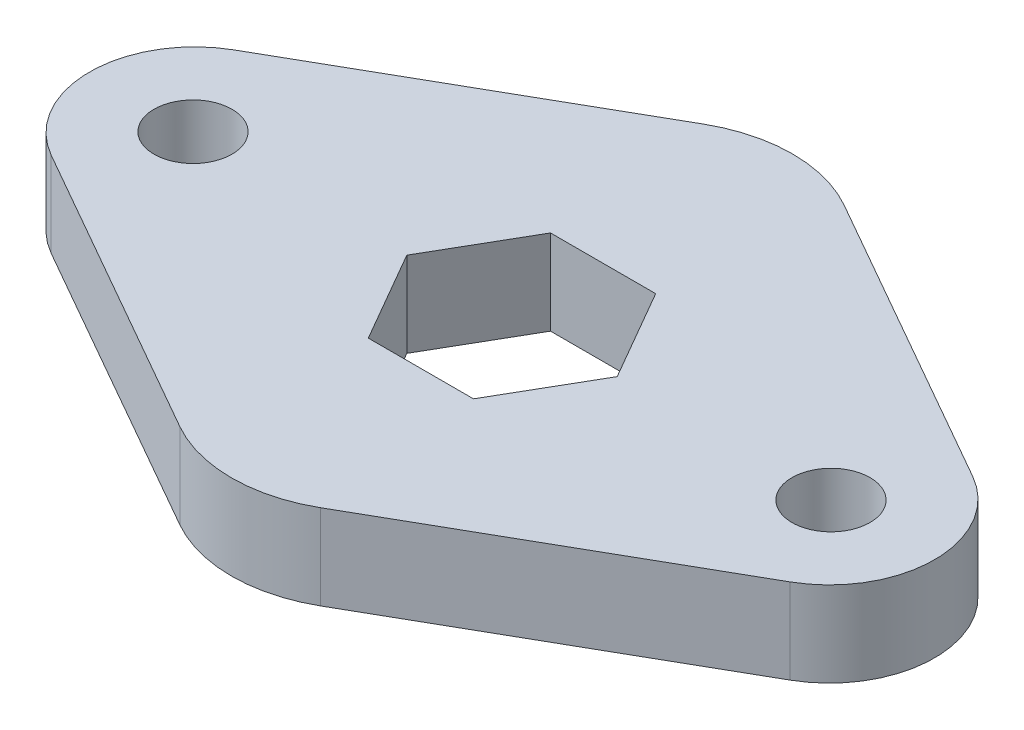
ISO-10303-21;
HEADER;
FILE_DESCRIPTION(('STEP AP214'),'2;1');
FILE_NAME('part.step','',(''),(''),'','','');
FILE_SCHEMA(('AUTOMOTIVE_DESIGN { 1 0 10303 214 1 1 1 1 }'));
ENDSEC;
DATA;
#1=APPLICATION_CONTEXT('core data for automotive mechanical design processes');
#2=APPLICATION_PROTOCOL_DEFINITION('international standard','automotive_design',2000,#1);
#3=PRODUCT_CONTEXT('',#1,'mechanical');
#4=PRODUCT('Part','Part','',(#3));
#5=PRODUCT_RELATED_PRODUCT_CATEGORY('part','',(#4));
#6=PRODUCT_DEFINITION_FORMATION('','',#4);
#7=PRODUCT_DEFINITION_CONTEXT('part definition',#1,'design');
#8=PRODUCT_DEFINITION('design','',#6,#7);
#9=PRODUCT_DEFINITION_SHAPE('','',#8);
#10=(LENGTH_UNIT() NAMED_UNIT(*) SI_UNIT(.MILLI.,.METRE.));
#11=(NAMED_UNIT(*) PLANE_ANGLE_UNIT() SI_UNIT($,.RADIAN.));
#12=(NAMED_UNIT(*) SI_UNIT($,.STERADIAN.) SOLID_ANGLE_UNIT());
#13=UNCERTAINTY_MEASURE_WITH_UNIT(LENGTH_MEASURE(1.E-05),#10,'distance_accuracy_value','');
#14=(GEOMETRIC_REPRESENTATION_CONTEXT(3) GLOBAL_UNCERTAINTY_ASSIGNED_CONTEXT((#13)) GLOBAL_UNIT_ASSIGNED_CONTEXT((#10,
#11,#12)) REPRESENTATION_CONTEXT('',''));
#15=CARTESIAN_POINT('',(0.,0.,0.));
#16=DIRECTION('',(0.,0.,1.));
#17=DIRECTION('',(1.,0.,0.));
#18=AXIS2_PLACEMENT_3D('',#15,#16,#17);
#19=CARTESIAN_POINT('',(190.,-173.122439360108,-14.3881775510622));
#20=DIRECTION('',(0.,-1.,0.));
#21=DIRECTION('',(0.,0.,-1.));
#22=AXIS2_PLACEMENT_3D('',#19,#20,#21);
#23=PLANE('',#22);
#24=CARTESIAN_POINT('',(167.5,-173.122439360108,-4.60000000000002));
#25=DIRECTION('',(0.,-1.,0.));
#26=DIRECTION('',(0.,0.,-1.));
#27=AXIS2_PLACEMENT_3D('',#24,#25,#26);
#28=CIRCLE('',#27,2.75000000000001);
#29=CARTESIAN_POINT('',(167.5,-173.122439360108,-7.35000000000003));
#30=VERTEX_POINT('',#29);
#31=EDGE_CURVE('E187',#30,#30,#28,.T.);
#32=ORIENTED_EDGE('',*,*,#31,.F.);
#33=EDGE_LOOP('',(#32));
#34=FACE_BOUND('',#33,.T.);
#35=CARTESIAN_POINT('',(190.,-173.122439360108,-14.3881775510622));
#36=DIRECTION('',(0.,-1.,0.));
#37=DIRECTION('',(0.,0.,-1.));
#38=AXIS2_PLACEMENT_3D('',#35,#36,#37);
#39=CIRCLE('',#38,10.);
#40=CARTESIAN_POINT('',(185.04612647539,-173.122439360108,-23.0748994357648));
#41=VERTEX_POINT('',#40);
#42=CARTESIAN_POINT('',(194.95387352461,-173.122439360108,-23.0748994357648));
#43=VERTEX_POINT('',#42);
#44=EDGE_CURVE('E199',#41,#43,#39,.T.);
#45=ORIENTED_EDGE('',*,*,#44,.T.);
#46=DIRECTION('',(0.868672188470268,0.,0.495387352460956));
#47=VECTOR('',#46,1.);
#48=CARTESIAN_POINT('',(216.05982548892,-173.122439360108,-11.0385734159574));
#49=LINE('',#48,#47);
#50=CARTESIAN_POINT('',(216.05982548892,-173.122439360108,-11.0385734159574));
#51=VERTEX_POINT('',#50);
#52=EDGE_CURVE('E202',#43,#51,#49,.T.);
#53=ORIENTED_EDGE('',*,*,#52,.T.);
#54=CARTESIAN_POINT('',(212.388028601105,-173.122439360108,-4.60000000000003));
#55=DIRECTION('',(0.,-1.,0.));
#56=DIRECTION('',(0.,0.,-1.));
#57=AXIS2_PLACEMENT_3D('',#54,#55,#56);
#58=CIRCLE('',#57,7.41197139889526);
#59=CARTESIAN_POINT('',(216.05982548892,-173.122439360108,1.83857341595736));
#60=VERTEX_POINT('',#59);
#61=EDGE_CURVE('E205',#51,#60,#58,.T.);
#62=ORIENTED_EDGE('',*,*,#61,.T.);
#63=DIRECTION('',(-0.868672188470268,0.,0.495387352460956));
#64=VECTOR('',#63,1.);
#65=CARTESIAN_POINT('',(216.05982548892,-173.122439360108,1.83857341595736));
#66=LINE('',#65,#64);
#67=CARTESIAN_POINT('',(194.95387352461,-173.122439360108,13.8748994357648));
#68=VERTEX_POINT('',#67);
#69=EDGE_CURVE('E207',#60,#68,#66,.T.);
#70=ORIENTED_EDGE('',*,*,#69,.T.);
#71=CARTESIAN_POINT('',(190.,-173.122439360108,5.18817755106213));
#72=DIRECTION('',(0.,-1.,0.));
#73=DIRECTION('',(0.,0.,-1.));
#74=AXIS2_PLACEMENT_3D('',#71,#72,#73);
#75=CIRCLE('',#74,10.);
#76=CARTESIAN_POINT('',(185.04612647539,-173.122439360108,13.8748994357648));
#77=VERTEX_POINT('',#76);
#78=EDGE_CURVE('E209',#68,#77,#75,.T.);
#79=ORIENTED_EDGE('',*,*,#78,.T.);
#80=DIRECTION('',(-0.868672188470268,0.,-0.495387352460956));
#81=VECTOR('',#80,1.);
#82=CARTESIAN_POINT('',(163.94017451108,-173.122439360108,1.83857341595736));
#83=LINE('',#82,#81);
#84=CARTESIAN_POINT('',(163.94017451108,-173.122439360108,1.83857341595736));
#85=VERTEX_POINT('',#84);
#86=EDGE_CURVE('E211',#77,#85,#83,.T.);
#87=ORIENTED_EDGE('',*,*,#86,.T.);
#88=CARTESIAN_POINT('',(167.611971398895,-173.122439360108,-4.60000000000003));
#89=DIRECTION('',(0.,-1.,0.));
#90=DIRECTION('',(0.,0.,-1.));
#91=AXIS2_PLACEMENT_3D('',#88,#89,#90);
#92=CIRCLE('',#91,7.41197139889526);
#93=CARTESIAN_POINT('',(163.94017451108,-173.122439360108,-11.0385734159574));
#94=VERTEX_POINT('',#93);
#95=EDGE_CURVE('E213',#85,#94,#92,.T.);
#96=ORIENTED_EDGE('',*,*,#95,.T.);
#97=DIRECTION('',(0.868672188470268,0.,-0.495387352460956));
#98=VECTOR('',#97,1.);
#99=CARTESIAN_POINT('',(163.94017451108,-173.122439360108,-11.0385734159574));
#100=LINE('',#99,#98);
#101=EDGE_CURVE('E215',#94,#41,#100,.T.);
#102=ORIENTED_EDGE('',*,*,#101,.T.);
#103=EDGE_LOOP('',(#45,#53,#62,#70,#79,#87,#96,#102));
#104=FACE_BOUND('',#103,.T.);
#105=CARTESIAN_POINT('',(212.5,-173.122439360108,-4.60000000000002));
#106=DIRECTION('',(0.,-1.,0.));
#107=DIRECTION('',(0.,0.,-1.));
#108=AXIS2_PLACEMENT_3D('',#105,#106,#107);
#109=CIRCLE('',#108,2.75000000000001);
#110=CARTESIAN_POINT('',(212.5,-173.122439360108,-7.35000000000003));
#111=VERTEX_POINT('',#110);
#112=EDGE_CURVE('E193',#111,#111,#109,.T.);
#113=ORIENTED_EDGE('',*,*,#112,.F.);
#114=EDGE_LOOP('',(#113));
#115=FACE_BOUND('',#114,.T.);
#116=DIRECTION('',(1.,0.,0.));
#117=VECTOR('',#116,1.);
#118=CARTESIAN_POINT('',(186.290524520457,-173.122439360108,-11.025));
#119=LINE('',#118,#117);
#120=CARTESIAN_POINT('',(186.290524520457,-173.122439360108,-11.025));
#121=VERTEX_POINT('',#120);
#122=CARTESIAN_POINT('',(193.709475479543,-173.122439360108,-11.025));
#123=VERTEX_POINT('',#122);
#124=EDGE_CURVE('E144',#121,#123,#119,.T.);
#125=ORIENTED_EDGE('',*,*,#124,.F.);
#126=DIRECTION('',(0.500000000000002,0.,-0.866025403784437));
#127=VECTOR('',#126,1.);
#128=CARTESIAN_POINT('',(182.581049040913,-173.122439360108,-4.60000000000002));
#129=LINE('',#128,#127);
#130=CARTESIAN_POINT('',(182.581049040913,-173.122439360108,-4.60000000000002));
#131=VERTEX_POINT('',#130);
#132=EDGE_CURVE('E136',#131,#121,#129,.T.);
#133=ORIENTED_EDGE('',*,*,#132,.F.);
#134=DIRECTION('',(-0.500000000000002,0.,-0.866025403784437));
#135=VECTOR('',#134,1.);
#136=CARTESIAN_POINT('',(186.290524520457,-173.122439360108,1.82499999999998));
#137=LINE('',#136,#135);
#138=CARTESIAN_POINT('',(186.290524520457,-173.122439360108,1.82499999999998));
#139=VERTEX_POINT('',#138);
#140=EDGE_CURVE('E165',#139,#131,#137,.T.);
#141=ORIENTED_EDGE('',*,*,#140,.F.);
#142=DIRECTION('',(-1.,0.,0.));
#143=VECTOR('',#142,1.);
#144=CARTESIAN_POINT('',(193.709475479543,-173.122439360108,1.82499999999998));
#145=LINE('',#144,#143);
#146=CARTESIAN_POINT('',(193.709475479543,-173.122439360108,1.82499999999998));
#147=VERTEX_POINT('',#146);
#148=EDGE_CURVE('E163',#147,#139,#145,.T.);
#149=ORIENTED_EDGE('',*,*,#148,.F.);
#150=DIRECTION('',(-0.5,0.,0.866025403784438));
#151=VECTOR('',#150,1.);
#152=CARTESIAN_POINT('',(197.418950959087,-173.122439360108,-4.60000000000001));
#153=LINE('',#152,#151);
#154=CARTESIAN_POINT('',(197.418950959087,-173.122439360108,-4.60000000000001));
#155=VERTEX_POINT('',#154);
#156=EDGE_CURVE('E159',#155,#147,#153,.T.);
#157=ORIENTED_EDGE('',*,*,#156,.F.);
#158=DIRECTION('',(0.500000000000001,0.,0.866025403784438));
#159=VECTOR('',#158,1.);
#160=CARTESIAN_POINT('',(193.709475479543,-173.122439360108,-11.025));
#161=LINE('',#160,#159);
#162=EDGE_CURVE('E157',#123,#155,#161,.T.);
#163=ORIENTED_EDGE('',*,*,#162,.F.);
#164=EDGE_LOOP('',(#125,#133,#141,#149,#157,#163));
#165=FACE_BOUND('',#164,.T.);
#166=ADVANCED_FACE('F35',(#34,#104,#115,#165),#23,.T.);
#167=CARTESIAN_POINT('',(190.,-167.122439360108,-14.3881775510622));
#168=DIRECTION('',(0.,-1.,0.));
#169=DIRECTION('',(0.,0.,-1.));
#170=AXIS2_PLACEMENT_3D('',#167,#168,#169);
#171=PLANE('',#170);
#172=CARTESIAN_POINT('',(167.5,-167.122439360108,-4.60000000000002));
#173=DIRECTION('',(0.,-1.,0.));
#174=DIRECTION('',(0.,0.,-1.));
#175=AXIS2_PLACEMENT_3D('',#172,#173,#174);
#176=CIRCLE('',#175,2.75000000000001);
#177=CARTESIAN_POINT('',(167.5,-167.122439360108,-7.35000000000003));
#178=VERTEX_POINT('',#177);
#179=EDGE_CURVE('E152',#178,#178,#176,.T.);
#180=ORIENTED_EDGE('',*,*,#179,.T.);
#181=EDGE_LOOP('',(#180));
#182=FACE_BOUND('',#181,.T.);
#183=CARTESIAN_POINT('',(190.,-167.122439360108,-14.3881775510622));
#184=DIRECTION('',(0.,-1.,0.));
#185=DIRECTION('',(0.,0.,-1.));
#186=AXIS2_PLACEMENT_3D('',#183,#184,#185);
#187=CIRCLE('',#186,10.);
#188=CARTESIAN_POINT('',(185.04612647539,-167.122439360108,-23.0748994357648));
#189=VERTEX_POINT('',#188);
#190=CARTESIAN_POINT('',(194.95387352461,-167.122439360108,-23.0748994357648));
#191=VERTEX_POINT('',#190);
#192=EDGE_CURVE('E196',#189,#191,#187,.T.);
#193=ORIENTED_EDGE('',*,*,#192,.F.);
#194=DIRECTION('',(0.868672188470268,0.,-0.495387352460956));
#195=VECTOR('',#194,1.);
#196=CARTESIAN_POINT('',(163.94017451108,-167.122439360108,-11.0385734159574));
#197=LINE('',#196,#195);
#198=CARTESIAN_POINT('',(163.94017451108,-167.122439360108,-11.0385734159574));
#199=VERTEX_POINT('',#198);
#200=EDGE_CURVE('E203',#199,#189,#197,.T.);
#201=ORIENTED_EDGE('',*,*,#200,.F.);
#202=CARTESIAN_POINT('',(167.611971398895,-167.122439360108,-4.60000000000003));
#203=DIRECTION('',(0.,-1.,0.));
#204=DIRECTION('',(0.,0.,-1.));
#205=AXIS2_PLACEMENT_3D('',#202,#203,#204);
#206=CIRCLE('',#205,7.41197139889526);
#207=CARTESIAN_POINT('',(163.94017451108,-167.122439360108,1.83857341595736));
#208=VERTEX_POINT('',#207);
#209=EDGE_CURVE('E230',#208,#199,#206,.T.);
#210=ORIENTED_EDGE('',*,*,#209,.F.);
#211=DIRECTION('',(-0.868672188470268,0.,-0.495387352460956));
#212=VECTOR('',#211,1.);
#213=CARTESIAN_POINT('',(163.94017451108,-167.122439360108,1.83857341595736));
#214=LINE('',#213,#212);
#215=CARTESIAN_POINT('',(185.04612647539,-167.122439360108,13.8748994357648));
#216=VERTEX_POINT('',#215);
#217=EDGE_CURVE('E228',#216,#208,#214,.T.);
#218=ORIENTED_EDGE('',*,*,#217,.F.);
#219=CARTESIAN_POINT('',(190.,-167.122439360108,5.18817755106213));
#220=DIRECTION('',(0.,-1.,0.));
#221=DIRECTION('',(0.,0.,-1.));
#222=AXIS2_PLACEMENT_3D('',#219,#220,#221);
#223=CIRCLE('',#222,10.);
#224=CARTESIAN_POINT('',(194.95387352461,-167.122439360108,13.8748994357648));
#225=VERTEX_POINT('',#224);
#226=EDGE_CURVE('E226',#225,#216,#223,.T.);
#227=ORIENTED_EDGE('',*,*,#226,.F.);
#228=DIRECTION('',(-0.868672188470268,0.,0.495387352460956));
#229=VECTOR('',#228,1.);
#230=CARTESIAN_POINT('',(216.05982548892,-167.122439360108,1.83857341595736));
#231=LINE('',#230,#229);
#232=CARTESIAN_POINT('',(216.05982548892,-167.122439360108,1.83857341595736));
#233=VERTEX_POINT('',#232);
#234=EDGE_CURVE('E224',#233,#225,#231,.T.);
#235=ORIENTED_EDGE('',*,*,#234,.F.);
#236=CARTESIAN_POINT('',(212.388028601105,-167.122439360108,-4.60000000000003));
#237=DIRECTION('',(0.,-1.,0.));
#238=DIRECTION('',(0.,0.,-1.));
#239=AXIS2_PLACEMENT_3D('',#236,#237,#238);
#240=CIRCLE('',#239,7.41197139889526);
#241=CARTESIAN_POINT('',(216.05982548892,-167.122439360108,-11.0385734159574));
#242=VERTEX_POINT('',#241);
#243=EDGE_CURVE('E222',#242,#233,#240,.T.);
#244=ORIENTED_EDGE('',*,*,#243,.F.);
#245=DIRECTION('',(0.868672188470268,0.,0.495387352460956));
#246=VECTOR('',#245,1.);
#247=CARTESIAN_POINT('',(216.05982548892,-167.122439360108,-11.0385734159574));
#248=LINE('',#247,#246);
#249=EDGE_CURVE('E220',#191,#242,#248,.T.);
#250=ORIENTED_EDGE('',*,*,#249,.F.);
#251=EDGE_LOOP('',(#193,#201,#210,#218,#227,#235,#244,#250));
#252=FACE_BOUND('',#251,.T.);
#253=CARTESIAN_POINT('',(212.5,-167.122439360108,-4.60000000000002));
#254=DIRECTION('',(0.,-1.,0.));
#255=DIRECTION('',(0.,0.,-1.));
#256=AXIS2_PLACEMENT_3D('',#253,#254,#255);
#257=CIRCLE('',#256,2.75000000000001);
#258=CARTESIAN_POINT('',(212.5,-167.122439360108,-7.35000000000003));
#259=VERTEX_POINT('',#258);
#260=EDGE_CURVE('E190',#259,#259,#257,.T.);
#261=ORIENTED_EDGE('',*,*,#260,.T.);
#262=EDGE_LOOP('',(#261));
#263=FACE_BOUND('',#262,.T.);
#264=DIRECTION('',(0.500000000000002,0.,-0.866025403784437));
#265=VECTOR('',#264,1.);
#266=CARTESIAN_POINT('',(182.581049040913,-167.122439360108,-4.60000000000002));
#267=LINE('',#266,#265);
#268=CARTESIAN_POINT('',(182.581049040913,-167.122439360108,-4.60000000000002));
#269=VERTEX_POINT('',#268);
#270=CARTESIAN_POINT('',(186.290524520457,-167.122439360108,-11.025));
#271=VERTEX_POINT('',#270);
#272=EDGE_CURVE('E58',#269,#271,#267,.T.);
#273=ORIENTED_EDGE('',*,*,#272,.T.);
#274=DIRECTION('',(1.,0.,0.));
#275=VECTOR('',#274,1.);
#276=CARTESIAN_POINT('',(186.290524520457,-167.122439360108,-11.025));
#277=LINE('',#276,#275);
#278=CARTESIAN_POINT('',(193.709475479543,-167.122439360108,-11.025));
#279=VERTEX_POINT('',#278);
#280=EDGE_CURVE('E151',#271,#279,#277,.T.);
#281=ORIENTED_EDGE('',*,*,#280,.T.);
#282=DIRECTION('',(0.500000000000001,0.,0.866025403784438));
#283=VECTOR('',#282,1.);
#284=CARTESIAN_POINT('',(193.709475479543,-167.122439360108,-11.025));
#285=LINE('',#284,#283);
#286=CARTESIAN_POINT('',(197.418950959087,-167.122439360108,-4.60000000000001));
#287=VERTEX_POINT('',#286);
#288=EDGE_CURVE('E169',#279,#287,#285,.T.);
#289=ORIENTED_EDGE('',*,*,#288,.T.);
#290=DIRECTION('',(-0.5,0.,0.866025403784438));
#291=VECTOR('',#290,1.);
#292=CARTESIAN_POINT('',(197.418950959087,-167.122439360108,-4.60000000000001));
#293=LINE('',#292,#291);
#294=CARTESIAN_POINT('',(193.709475479543,-167.122439360108,1.82499999999998));
#295=VERTEX_POINT('',#294);
#296=EDGE_CURVE('E172',#287,#295,#293,.T.);
#297=ORIENTED_EDGE('',*,*,#296,.T.);
#298=DIRECTION('',(-1.,0.,0.));
#299=VECTOR('',#298,1.);
#300=CARTESIAN_POINT('',(193.709475479543,-167.122439360108,1.82499999999998));
#301=LINE('',#300,#299);
#302=CARTESIAN_POINT('',(186.290524520457,-167.122439360108,1.82499999999998));
#303=VERTEX_POINT('',#302);
#304=EDGE_CURVE('E175',#295,#303,#301,.T.);
#305=ORIENTED_EDGE('',*,*,#304,.T.);
#306=DIRECTION('',(-0.500000000000002,0.,-0.866025403784437));
#307=VECTOR('',#306,1.);
#308=CARTESIAN_POINT('',(186.290524520457,-167.122439360108,1.82499999999998));
#309=LINE('',#308,#307);
#310=EDGE_CURVE('E145',#303,#269,#309,.T.);
#311=ORIENTED_EDGE('',*,*,#310,.T.);
#312=EDGE_LOOP('',(#273,#281,#289,#297,#305,#311));
#313=FACE_BOUND('',#312,.T.);
#314=ADVANCED_FACE('F260',(#182,#252,#263,#313),#171,.F.);
#315=CARTESIAN_POINT('',(190.,-173.122439360108,-14.3881775510622));
#316=DIRECTION('',(0.,1.,0.));
#317=DIRECTION('',(0.,0.,1.));
#318=AXIS2_PLACEMENT_3D('',#315,#316,#317);
#319=CYLINDRICAL_SURFACE('',#318,10.);
#320=ORIENTED_EDGE('',*,*,#192,.T.);
#321=DIRECTION('',(0.,1.,0.));
#322=VECTOR('',#321,1.);
#323=CARTESIAN_POINT('',(194.95387352461,-173.122439360108,-23.0748994357648));
#324=LINE('',#323,#322);
#325=EDGE_CURVE('E11',#43,#191,#324,.T.);
#326=ORIENTED_EDGE('',*,*,#325,.F.);
#327=ORIENTED_EDGE('',*,*,#44,.F.);
#328=DIRECTION('',(0.,1.,0.));
#329=VECTOR('',#328,1.);
#330=CARTESIAN_POINT('',(185.04612647539,-173.122439360108,-23.0748994357648));
#331=LINE('',#330,#329);
#332=EDGE_CURVE('E217',#41,#189,#331,.T.);
#333=ORIENTED_EDGE('',*,*,#332,.T.);
#334=EDGE_LOOP('',(#320,#326,#327,#333));
#335=FACE_BOUND('',#334,.T.);
#336=ADVANCED_FACE('F37',(#335),#319,.T.);
#337=CARTESIAN_POINT('',(216.05982548892,-173.122439360108,-11.0385734159574));
#338=DIRECTION('',(-0.495387352460956,0.,0.868672188470268));
#339=DIRECTION('',(0.868672188470268,0.,0.495387352460956));
#340=AXIS2_PLACEMENT_3D('',#337,#338,#339);
#341=PLANE('',#340);
#342=ORIENTED_EDGE('',*,*,#249,.T.);
#343=DIRECTION('',(0.,1.,0.));
#344=VECTOR('',#343,1.);
#345=CARTESIAN_POINT('',(216.05982548892,-173.122439360108,-11.0385734159574));
#346=LINE('',#345,#344);
#347=EDGE_CURVE('E43',#51,#242,#346,.T.);
#348=ORIENTED_EDGE('',*,*,#347,.F.);
#349=ORIENTED_EDGE('',*,*,#52,.F.);
#350=ORIENTED_EDGE('',*,*,#325,.T.);
#351=EDGE_LOOP('',(#342,#348,#349,#350));
#352=FACE_BOUND('',#351,.T.);
#353=ADVANCED_FACE('F278',(#352),#341,.F.);
#354=CARTESIAN_POINT('',(212.388028601105,-173.122439360108,-4.60000000000003));
#355=DIRECTION('',(0.,1.,0.));
#356=DIRECTION('',(0.,0.,1.));
#357=AXIS2_PLACEMENT_3D('',#354,#355,#356);
#358=CYLINDRICAL_SURFACE('',#357,7.41197139889526);
#359=ORIENTED_EDGE('',*,*,#243,.T.);
#360=DIRECTION('',(0.,1.,0.));
#361=VECTOR('',#360,1.);
#362=CARTESIAN_POINT('',(216.05982548892,-173.122439360108,1.83857341595736));
#363=LINE('',#362,#361);
#364=EDGE_CURVE('E247',#60,#233,#363,.T.);
#365=ORIENTED_EDGE('',*,*,#364,.F.);
#366=ORIENTED_EDGE('',*,*,#61,.F.);
#367=ORIENTED_EDGE('',*,*,#347,.T.);
#368=EDGE_LOOP('',(#359,#365,#366,#367));
#369=FACE_BOUND('',#368,.T.);
#370=ADVANCED_FACE('F254',(#369),#358,.T.);
#371=CARTESIAN_POINT('',(216.05982548892,-173.122439360108,1.83857341595736));
#372=DIRECTION('',(-0.495387352460957,0.,-0.868672188470268));
#373=DIRECTION('',(-0.868672188470268,0.,0.495387352460957));
#374=AXIS2_PLACEMENT_3D('',#371,#372,#373);
#375=PLANE('',#374);
#376=ORIENTED_EDGE('',*,*,#234,.T.);
#377=DIRECTION('',(0.,1.,0.));
#378=VECTOR('',#377,1.);
#379=CARTESIAN_POINT('',(194.95387352461,-173.122439360108,13.8748994357648));
#380=LINE('',#379,#378);
#381=EDGE_CURVE('E244',#68,#225,#380,.T.);
#382=ORIENTED_EDGE('',*,*,#381,.F.);
#383=ORIENTED_EDGE('',*,*,#69,.F.);
#384=ORIENTED_EDGE('',*,*,#364,.T.);
#385=EDGE_LOOP('',(#376,#382,#383,#384));
#386=FACE_BOUND('',#385,.T.);
#387=ADVANCED_FACE('F266',(#386),#375,.F.);
#388=CARTESIAN_POINT('',(190.,-173.122439360108,5.18817755106213));
#389=DIRECTION('',(0.,1.,0.));
#390=DIRECTION('',(0.,0.,1.));
#391=AXIS2_PLACEMENT_3D('',#388,#389,#390);
#392=CYLINDRICAL_SURFACE('',#391,10.);
#393=ORIENTED_EDGE('',*,*,#226,.T.);
#394=DIRECTION('',(0.,1.,0.));
#395=VECTOR('',#394,1.);
#396=CARTESIAN_POINT('',(185.04612647539,-173.122439360108,13.8748994357648));
#397=LINE('',#396,#395);
#398=EDGE_CURVE('E241',#77,#216,#397,.T.);
#399=ORIENTED_EDGE('',*,*,#398,.F.);
#400=ORIENTED_EDGE('',*,*,#78,.F.);
#401=ORIENTED_EDGE('',*,*,#381,.T.);
#402=EDGE_LOOP('',(#393,#399,#400,#401));
#403=FACE_BOUND('',#402,.T.);
#404=ADVANCED_FACE('F270',(#403),#392,.T.);
#405=CARTESIAN_POINT('',(163.94017451108,-173.122439360108,1.83857341595736));
#406=DIRECTION('',(0.495387352460957,0.,-0.868672188470268));
#407=DIRECTION('',(-0.868672188470268,0.,-0.495387352460957));
#408=AXIS2_PLACEMENT_3D('',#405,#406,#407);
#409=PLANE('',#408);
#410=ORIENTED_EDGE('',*,*,#217,.T.);
#411=DIRECTION('',(0.,1.,0.));
#412=VECTOR('',#411,1.);
#413=CARTESIAN_POINT('',(163.94017451108,-173.122439360108,1.83857341595736));
#414=LINE('',#413,#412);
#415=EDGE_CURVE('E238',#85,#208,#414,.T.);
#416=ORIENTED_EDGE('',*,*,#415,.F.);
#417=ORIENTED_EDGE('',*,*,#86,.F.);
#418=ORIENTED_EDGE('',*,*,#398,.T.);
#419=EDGE_LOOP('',(#410,#416,#417,#418));
#420=FACE_BOUND('',#419,.T.);
#421=ADVANCED_FACE('F291',(#420),#409,.F.);
#422=CARTESIAN_POINT('',(167.611971398895,-173.122439360108,-4.60000000000003));
#423=DIRECTION('',(0.,1.,0.));
#424=DIRECTION('',(0.,0.,1.));
#425=AXIS2_PLACEMENT_3D('',#422,#423,#424);
#426=CYLINDRICAL_SURFACE('',#425,7.41197139889526);
#427=ORIENTED_EDGE('',*,*,#209,.T.);
#428=DIRECTION('',(0.,1.,0.));
#429=VECTOR('',#428,1.);
#430=CARTESIAN_POINT('',(163.94017451108,-173.122439360108,-11.0385734159574));
#431=LINE('',#430,#429);
#432=EDGE_CURVE('E235',#94,#199,#431,.T.);
#433=ORIENTED_EDGE('',*,*,#432,.F.);
#434=ORIENTED_EDGE('',*,*,#95,.F.);
#435=ORIENTED_EDGE('',*,*,#415,.T.);
#436=EDGE_LOOP('',(#427,#433,#434,#435));
#437=FACE_BOUND('',#436,.T.);
#438=ADVANCED_FACE('F289',(#437),#426,.T.);
#439=CARTESIAN_POINT('',(163.94017451108,-173.122439360108,-11.0385734159574));
#440=DIRECTION('',(0.495387352460956,0.,0.868672188470268));
#441=DIRECTION('',(0.868672188470268,0.,-0.495387352460956));
#442=AXIS2_PLACEMENT_3D('',#439,#440,#441);
#443=PLANE('',#442);
#444=ORIENTED_EDGE('',*,*,#200,.T.);
#445=ORIENTED_EDGE('',*,*,#332,.F.);
#446=ORIENTED_EDGE('',*,*,#101,.F.);
#447=ORIENTED_EDGE('',*,*,#432,.T.);
#448=EDGE_LOOP('',(#444,#445,#446,#447));
#449=FACE_BOUND('',#448,.T.);
#450=ADVANCED_FACE('F284',(#449),#443,.F.);
#451=CARTESIAN_POINT('',(212.5,-173.122439360108,-4.60000000000002));
#452=DIRECTION('',(0.,1.,0.));
#453=DIRECTION('',(0.,0.,1.));
#454=AXIS2_PLACEMENT_3D('',#451,#452,#453);
#455=CYLINDRICAL_SURFACE('',#454,2.75000000000001);
#456=ORIENTED_EDGE('',*,*,#112,.T.);
#457=EDGE_LOOP('',(#456));
#458=FACE_BOUND('',#457,.T.);
#459=ORIENTED_EDGE('',*,*,#260,.F.);
#460=EDGE_LOOP('',(#459));
#461=FACE_BOUND('',#460,.T.);
#462=ADVANCED_FACE('F310',(#458,#461),#455,.F.);
#463=CARTESIAN_POINT('',(167.5,-173.122439360108,-4.60000000000002));
#464=DIRECTION('',(0.,1.,0.));
#465=DIRECTION('',(0.,0.,1.));
#466=AXIS2_PLACEMENT_3D('',#463,#464,#465);
#467=CYLINDRICAL_SURFACE('',#466,2.75000000000001);
#468=ORIENTED_EDGE('',*,*,#31,.T.);
#469=EDGE_LOOP('',(#468));
#470=FACE_BOUND('',#469,.T.);
#471=ORIENTED_EDGE('',*,*,#179,.F.);
#472=EDGE_LOOP('',(#471));
#473=FACE_BOUND('',#472,.T.);
#474=ADVANCED_FACE('F317',(#470,#473),#467,.F.);
#475=CARTESIAN_POINT('',(182.581049040913,-173.122439360108,-4.60000000000002));
#476=DIRECTION('',(0.866025403784437,0.,0.500000000000002));
#477=DIRECTION('',(0.500000000000002,0.,-0.866025403784437));
#478=AXIS2_PLACEMENT_3D('',#475,#476,#477);
#479=PLANE('',#478);
#480=ORIENTED_EDGE('',*,*,#272,.F.);
#481=DIRECTION('',(0.,1.,0.));
#482=VECTOR('',#481,1.);
#483=CARTESIAN_POINT('',(182.581049040913,-173.122439360108,-4.60000000000002));
#484=LINE('',#483,#482);
#485=EDGE_CURVE('E140',#131,#269,#484,.T.);
#486=ORIENTED_EDGE('',*,*,#485,.F.);
#487=ORIENTED_EDGE('',*,*,#132,.T.);
#488=DIRECTION('',(0.,1.,0.));
#489=VECTOR('',#488,1.);
#490=CARTESIAN_POINT('',(186.290524520457,-173.122439360108,-11.025));
#491=LINE('',#490,#489);
#492=EDGE_CURVE('E139',#121,#271,#491,.T.);
#493=ORIENTED_EDGE('',*,*,#492,.T.);
#494=EDGE_LOOP('',(#480,#486,#487,#493));
#495=FACE_BOUND('',#494,.T.);
#496=ADVANCED_FACE('F138',(#495),#479,.T.);
#497=CARTESIAN_POINT('',(186.290524520457,-173.122439360108,-11.025));
#498=DIRECTION('',(0.,0.,1.));
#499=DIRECTION('',(1.,0.,0.));
#500=AXIS2_PLACEMENT_3D('',#497,#498,#499);
#501=PLANE('',#500);
#502=ORIENTED_EDGE('',*,*,#280,.F.);
#503=ORIENTED_EDGE('',*,*,#492,.F.);
#504=ORIENTED_EDGE('',*,*,#124,.T.);
#505=DIRECTION('',(0.,1.,0.));
#506=VECTOR('',#505,1.);
#507=CARTESIAN_POINT('',(193.709475479543,-173.122439360108,-11.025));
#508=LINE('',#507,#506);
#509=EDGE_CURVE('E153',#123,#279,#508,.T.);
#510=ORIENTED_EDGE('',*,*,#509,.T.);
#511=EDGE_LOOP('',(#502,#503,#504,#510));
#512=FACE_BOUND('',#511,.T.);
#513=ADVANCED_FACE('F148',(#512),#501,.T.);
#514=CARTESIAN_POINT('',(193.709475479543,-173.122439360108,-11.025));
#515=DIRECTION('',(-0.866025403784438,0.,0.500000000000001));
#516=DIRECTION('',(0.500000000000001,0.,0.866025403784438));
#517=AXIS2_PLACEMENT_3D('',#514,#515,#516);
#518=PLANE('',#517);
#519=ORIENTED_EDGE('',*,*,#288,.F.);
#520=ORIENTED_EDGE('',*,*,#509,.F.);
#521=ORIENTED_EDGE('',*,*,#162,.T.);
#522=DIRECTION('',(0.,1.,0.));
#523=VECTOR('',#522,1.);
#524=CARTESIAN_POINT('',(197.418950959087,-173.122439360108,-4.60000000000001));
#525=LINE('',#524,#523);
#526=EDGE_CURVE('E184',#155,#287,#525,.T.);
#527=ORIENTED_EDGE('',*,*,#526,.T.);
#528=EDGE_LOOP('',(#519,#520,#521,#527));
#529=FACE_BOUND('',#528,.T.);
#530=ADVANCED_FACE('F339',(#529),#518,.T.);
#531=CARTESIAN_POINT('',(197.418950959087,-173.122439360108,-4.60000000000001));
#532=DIRECTION('',(-0.866025403784439,0.,-0.5));
#533=DIRECTION('',(-0.5,0.,0.866025403784439));
#534=AXIS2_PLACEMENT_3D('',#531,#532,#533);
#535=PLANE('',#534);
#536=ORIENTED_EDGE('',*,*,#296,.F.);
#537=ORIENTED_EDGE('',*,*,#526,.F.);
#538=ORIENTED_EDGE('',*,*,#156,.T.);
#539=DIRECTION('',(0.,1.,0.));
#540=VECTOR('',#539,1.);
#541=CARTESIAN_POINT('',(193.709475479543,-173.122439360108,1.82499999999998));
#542=LINE('',#541,#540);
#543=EDGE_CURVE('E182',#147,#295,#542,.T.);
#544=ORIENTED_EDGE('',*,*,#543,.T.);
#545=EDGE_LOOP('',(#536,#537,#538,#544));
#546=FACE_BOUND('',#545,.T.);
#547=ADVANCED_FACE('F335',(#546),#535,.T.);
#548=CARTESIAN_POINT('',(193.709475479543,-173.122439360108,1.82499999999998));
#549=DIRECTION('',(0.,0.,-1.));
#550=DIRECTION('',(-1.,0.,0.));
#551=AXIS2_PLACEMENT_3D('',#548,#549,#550);
#552=PLANE('',#551);
#553=ORIENTED_EDGE('',*,*,#304,.F.);
#554=ORIENTED_EDGE('',*,*,#543,.F.);
#555=ORIENTED_EDGE('',*,*,#148,.T.);
#556=DIRECTION('',(0.,1.,0.));
#557=VECTOR('',#556,1.);
#558=CARTESIAN_POINT('',(186.290524520457,-173.122439360108,1.82499999999998));
#559=LINE('',#558,#557);
#560=EDGE_CURVE('E50',#139,#303,#559,.T.);
#561=ORIENTED_EDGE('',*,*,#560,.T.);
#562=EDGE_LOOP('',(#553,#554,#555,#561));
#563=FACE_BOUND('',#562,.T.);
#564=ADVANCED_FACE('F332',(#563),#552,.T.);
#565=CARTESIAN_POINT('',(186.290524520457,-173.122439360108,1.82499999999998));
#566=DIRECTION('',(0.866025403784437,0.,-0.500000000000002));
#567=DIRECTION('',(-0.500000000000002,0.,-0.866025403784438));
#568=AXIS2_PLACEMENT_3D('',#565,#566,#567);
#569=PLANE('',#568);
#570=ORIENTED_EDGE('',*,*,#310,.F.);
#571=ORIENTED_EDGE('',*,*,#560,.F.);
#572=ORIENTED_EDGE('',*,*,#140,.T.);
#573=ORIENTED_EDGE('',*,*,#485,.T.);
#574=EDGE_LOOP('',(#570,#571,#572,#573));
#575=FACE_BOUND('',#574,.T.);
#576=ADVANCED_FACE('F328',(#575),#569,.T.);
#577=CLOSED_SHELL('',(#166,#314,#336,#353,#370,#387,#404,#421,#438,#450,#462,#474,#496,#513,
#530,#547,#564,#576));
#578=MANIFOLD_SOLID_BREP('B2',#577);
#579=ADVANCED_BREP_SHAPE_REPRESENTATION('',(#18,#578),#14);
#580=SHAPE_DEFINITION_REPRESENTATION(#9,#579);
ENDSEC;
END-ISO-10303-21;
